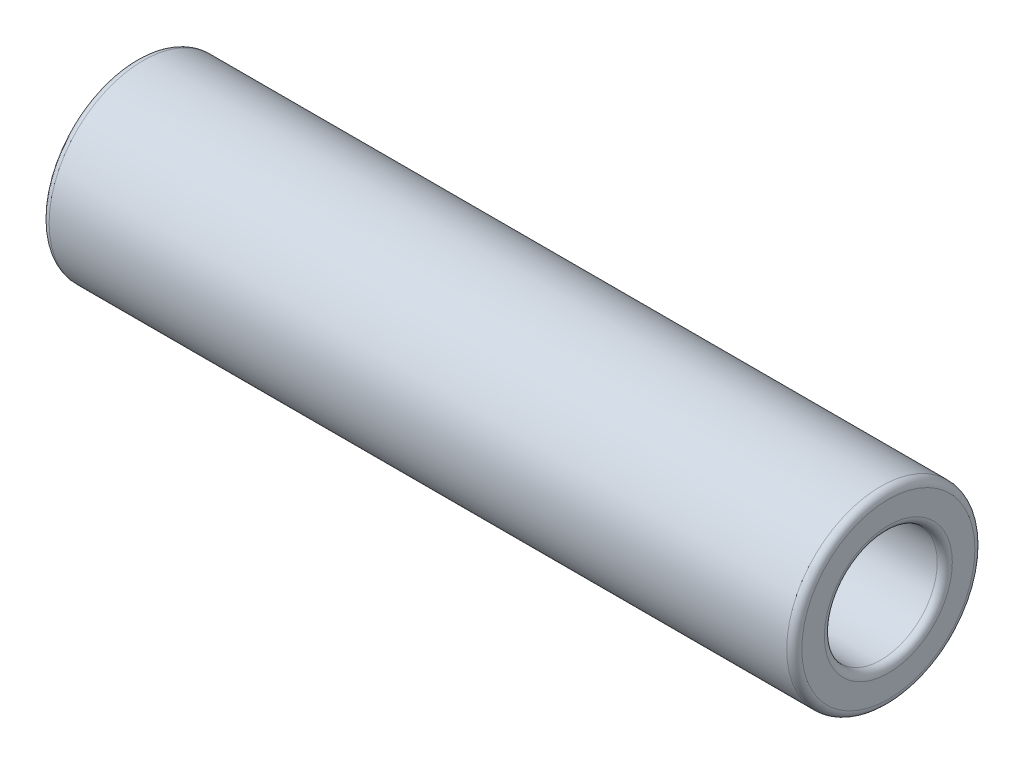
ISO-10303-21;
HEADER;
FILE_DESCRIPTION(('STEP AP214'),'2;1');
FILE_NAME('part.step','',(''),(''),'','','');
FILE_SCHEMA(('AUTOMOTIVE_DESIGN { 1 0 10303 214 1 1 1 1 }'));
ENDSEC;
DATA;
#1=APPLICATION_CONTEXT('core data for automotive mechanical design processes');
#2=APPLICATION_PROTOCOL_DEFINITION('international standard','automotive_design',2000,#1);
#3=PRODUCT_CONTEXT('',#1,'mechanical');
#4=PRODUCT('Part','Part','',(#3));
#5=PRODUCT_RELATED_PRODUCT_CATEGORY('part','',(#4));
#6=PRODUCT_DEFINITION_FORMATION('','',#4);
#7=PRODUCT_DEFINITION_CONTEXT('part definition',#1,'design');
#8=PRODUCT_DEFINITION('design','',#6,#7);
#9=PRODUCT_DEFINITION_SHAPE('','',#8);
#10=(LENGTH_UNIT() NAMED_UNIT(*) SI_UNIT(.MILLI.,.METRE.));
#11=(NAMED_UNIT(*) PLANE_ANGLE_UNIT() SI_UNIT($,.RADIAN.));
#12=(NAMED_UNIT(*) SI_UNIT($,.STERADIAN.) SOLID_ANGLE_UNIT());
#13=UNCERTAINTY_MEASURE_WITH_UNIT(LENGTH_MEASURE(1.E-05),#10,'distance_accuracy_value','');
#14=(GEOMETRIC_REPRESENTATION_CONTEXT(3) GLOBAL_UNCERTAINTY_ASSIGNED_CONTEXT((#13)) GLOBAL_UNIT_ASSIGNED_CONTEXT((#10,
#11,#12)) REPRESENTATION_CONTEXT('',''));
#15=CARTESIAN_POINT('',(0.,0.,0.));
#16=DIRECTION('',(0.,0.,1.));
#17=DIRECTION('',(1.,0.,0.));
#18=AXIS2_PLACEMENT_3D('',#15,#16,#17);
#19=CARTESIAN_POINT('',(50.,0.,0.));
#20=DIRECTION('',(1.,0.,0.));
#21=DIRECTION('',(0.,0.,-1.));
#22=AXIS2_PLACEMENT_3D('',#19,#20,#21);
#23=PLANE('',#22);
#24=CARTESIAN_POINT('',(50.,0.,0.));
#25=DIRECTION('',(1.,0.,0.));
#26=DIRECTION('',(0.,0.,-1.));
#27=AXIS2_PLACEMENT_3D('',#24,#25,#26);
#28=CIRCLE('',#27,4.25);
#29=CARTESIAN_POINT('',(50.,0.,-4.25));
#30=VERTEX_POINT('',#29);
#31=EDGE_CURVE('E10',#30,#30,#28,.F.);
#32=ORIENTED_EDGE('',*,*,#31,.T.);
#33=EDGE_LOOP('',(#32));
#34=FACE_BOUND('',#33,.T.);
#35=CARTESIAN_POINT('',(50.,0.,0.));
#36=DIRECTION('',(1.,0.,0.));
#37=DIRECTION('',(0.,0.,-1.));
#38=AXIS2_PLACEMENT_3D('',#35,#36,#37);
#39=CIRCLE('',#38,5.75);
#40=CARTESIAN_POINT('',(50.,0.,-5.75));
#41=VERTEX_POINT('',#40);
#42=EDGE_CURVE('E38',#41,#41,#39,.T.);
#43=ORIENTED_EDGE('',*,*,#42,.T.);
#44=EDGE_LOOP('',(#43));
#45=FACE_BOUND('',#44,.T.);
#46=ADVANCED_FACE('F31',(#34,#45),#23,.T.);
#47=CARTESIAN_POINT('',(0.,0.,0.));
#48=DIRECTION('',(1.,0.,0.));
#49=DIRECTION('',(0.,0.,-1.));
#50=AXIS2_PLACEMENT_3D('',#47,#48,#49);
#51=PLANE('',#50);
#52=CARTESIAN_POINT('',(0.,0.,0.));
#53=DIRECTION('',(1.,0.,0.));
#54=DIRECTION('',(0.,0.,-1.));
#55=AXIS2_PLACEMENT_3D('',#52,#53,#54);
#56=CIRCLE('',#55,4.25);
#57=CARTESIAN_POINT('',(0.,0.,-4.25));
#58=VERTEX_POINT('',#57);
#59=EDGE_CURVE('E57',#58,#58,#56,.T.);
#60=ORIENTED_EDGE('',*,*,#59,.T.);
#61=EDGE_LOOP('',(#60));
#62=FACE_BOUND('',#61,.T.);
#63=CARTESIAN_POINT('',(0.,0.,0.));
#64=DIRECTION('',(1.,0.,0.));
#65=DIRECTION('',(0.,0.,-1.));
#66=AXIS2_PLACEMENT_3D('',#63,#64,#65);
#67=CIRCLE('',#66,5.75);
#68=CARTESIAN_POINT('',(0.,0.,-5.75));
#69=VERTEX_POINT('',#68);
#70=EDGE_CURVE('E60',#69,#69,#67,.F.);
#71=ORIENTED_EDGE('',*,*,#70,.T.);
#72=EDGE_LOOP('',(#71));
#73=FACE_BOUND('',#72,.T.);
#74=ADVANCED_FACE('F64',(#62,#73),#51,.F.);
#75=CARTESIAN_POINT('',(50.,0.,0.));
#76=DIRECTION('',(-1.,0.,0.));
#77=DIRECTION('',(0.,0.,1.));
#78=AXIS2_PLACEMENT_3D('',#75,#76,#77);
#79=CYLINDRICAL_SURFACE('',#78,6.25);
#80=CARTESIAN_POINT('',(0.5,0.,0.));
#81=DIRECTION('',(1.,0.,0.));
#82=DIRECTION('',(0.,0.,-1.));
#83=AXIS2_PLACEMENT_3D('',#80,#81,#82);
#84=CIRCLE('',#83,6.25);
#85=CARTESIAN_POINT('',(0.5,0.,-6.25));
#86=VERTEX_POINT('',#85);
#87=EDGE_CURVE('E42',#86,#86,#84,.T.);
#88=ORIENTED_EDGE('',*,*,#87,.T.);
#89=EDGE_LOOP('',(#88));
#90=FACE_BOUND('',#89,.T.);
#91=CARTESIAN_POINT('',(49.5,0.,0.));
#92=DIRECTION('',(1.,0.,0.));
#93=DIRECTION('',(0.,0.,-1.));
#94=AXIS2_PLACEMENT_3D('',#91,#92,#93);
#95=CIRCLE('',#94,6.25);
#96=CARTESIAN_POINT('',(49.5,0.,-6.25));
#97=VERTEX_POINT('',#96);
#98=EDGE_CURVE('E46',#97,#97,#95,.F.);
#99=ORIENTED_EDGE('',*,*,#98,.T.);
#100=EDGE_LOOP('',(#99));
#101=FACE_BOUND('',#100,.T.);
#102=ADVANCED_FACE('F74',(#90,#101),#79,.T.);
#103=CARTESIAN_POINT('',(50.,0.,0.));
#104=DIRECTION('',(-1.,0.,0.));
#105=DIRECTION('',(0.,0.,1.));
#106=AXIS2_PLACEMENT_3D('',#103,#104,#105);
#107=CYLINDRICAL_SURFACE('',#106,3.75);
#108=CARTESIAN_POINT('',(0.5,0.,0.));
#109=DIRECTION('',(1.,0.,0.));
#110=DIRECTION('',(0.,0.,-1.));
#111=AXIS2_PLACEMENT_3D('',#108,#109,#110);
#112=CIRCLE('',#111,3.75);
#113=CARTESIAN_POINT('',(0.5,0.,-3.75));
#114=VERTEX_POINT('',#113);
#115=EDGE_CURVE('E51',#114,#114,#112,.F.);
#116=ORIENTED_EDGE('',*,*,#115,.T.);
#117=EDGE_LOOP('',(#116));
#118=FACE_BOUND('',#117,.T.);
#119=CARTESIAN_POINT('',(49.5,0.,0.));
#120=DIRECTION('',(1.,0.,0.));
#121=DIRECTION('',(0.,0.,-1.));
#122=AXIS2_PLACEMENT_3D('',#119,#120,#121);
#123=CIRCLE('',#122,3.75);
#124=CARTESIAN_POINT('',(49.5,0.,-3.75));
#125=VERTEX_POINT('',#124);
#126=EDGE_CURVE('E54',#125,#125,#123,.T.);
#127=ORIENTED_EDGE('',*,*,#126,.T.);
#128=EDGE_LOOP('',(#127));
#129=FACE_BOUND('',#128,.T.);
#130=ADVANCED_FACE('F77',(#118,#129),#107,.F.);
#131=CARTESIAN_POINT('',(0.5,0.,0.));
#132=DIRECTION('',(1.,0.,0.));
#133=DIRECTION('',(0.,0.,-1.));
#134=AXIS2_PLACEMENT_3D('',#131,#132,#133);
#135=TOROIDAL_SURFACE('',#134,4.25,0.5);
#136=ORIENTED_EDGE('',*,*,#115,.F.);
#137=EDGE_LOOP('',(#136));
#138=FACE_BOUND('',#137,.T.);
#139=ORIENTED_EDGE('',*,*,#59,.F.);
#140=EDGE_LOOP('',(#139));
#141=FACE_BOUND('',#140,.T.);
#142=ADVANCED_FACE('F70',(#138,#141),#135,.T.);
#143=CARTESIAN_POINT('',(0.5,0.,0.));
#144=DIRECTION('',(1.,0.,0.));
#145=DIRECTION('',(0.,0.,-1.));
#146=AXIS2_PLACEMENT_3D('',#143,#144,#145);
#147=TOROIDAL_SURFACE('',#146,5.75,0.5);
#148=ORIENTED_EDGE('',*,*,#70,.F.);
#149=EDGE_LOOP('',(#148));
#150=FACE_BOUND('',#149,.T.);
#151=ORIENTED_EDGE('',*,*,#87,.F.);
#152=EDGE_LOOP('',(#151));
#153=FACE_BOUND('',#152,.T.);
#154=ADVANCED_FACE('F66',(#150,#153),#147,.T.);
#155=CARTESIAN_POINT('',(49.5,0.,0.));
#156=DIRECTION('',(1.,0.,0.));
#157=DIRECTION('',(0.,0.,-1.));
#158=AXIS2_PLACEMENT_3D('',#155,#156,#157);
#159=TOROIDAL_SURFACE('',#158,4.25,0.5);
#160=ORIENTED_EDGE('',*,*,#31,.F.);
#161=EDGE_LOOP('',(#160));
#162=FACE_BOUND('',#161,.T.);
#163=ORIENTED_EDGE('',*,*,#126,.F.);
#164=EDGE_LOOP('',(#163));
#165=FACE_BOUND('',#164,.T.);
#166=ADVANCED_FACE('F69',(#162,#165),#159,.T.);
#167=CARTESIAN_POINT('',(49.5,0.,0.));
#168=DIRECTION('',(1.,0.,0.));
#169=DIRECTION('',(0.,0.,-1.));
#170=AXIS2_PLACEMENT_3D('',#167,#168,#169);
#171=TOROIDAL_SURFACE('',#170,5.75,0.5);
#172=ORIENTED_EDGE('',*,*,#98,.F.);
#173=EDGE_LOOP('',(#172));
#174=FACE_BOUND('',#173,.T.);
#175=ORIENTED_EDGE('',*,*,#42,.F.);
#176=EDGE_LOOP('',(#175));
#177=FACE_BOUND('',#176,.T.);
#178=ADVANCED_FACE('F33',(#174,#177),#171,.T.);
#179=CLOSED_SHELL('',(#46,#74,#102,#130,#142,#154,#166,#178));
#180=MANIFOLD_SOLID_BREP('B2',#179);
#181=ADVANCED_BREP_SHAPE_REPRESENTATION('',(#18,#180),#14);
#182=SHAPE_DEFINITION_REPRESENTATION(#9,#181);
ENDSEC;
END-ISO-10303-21;
